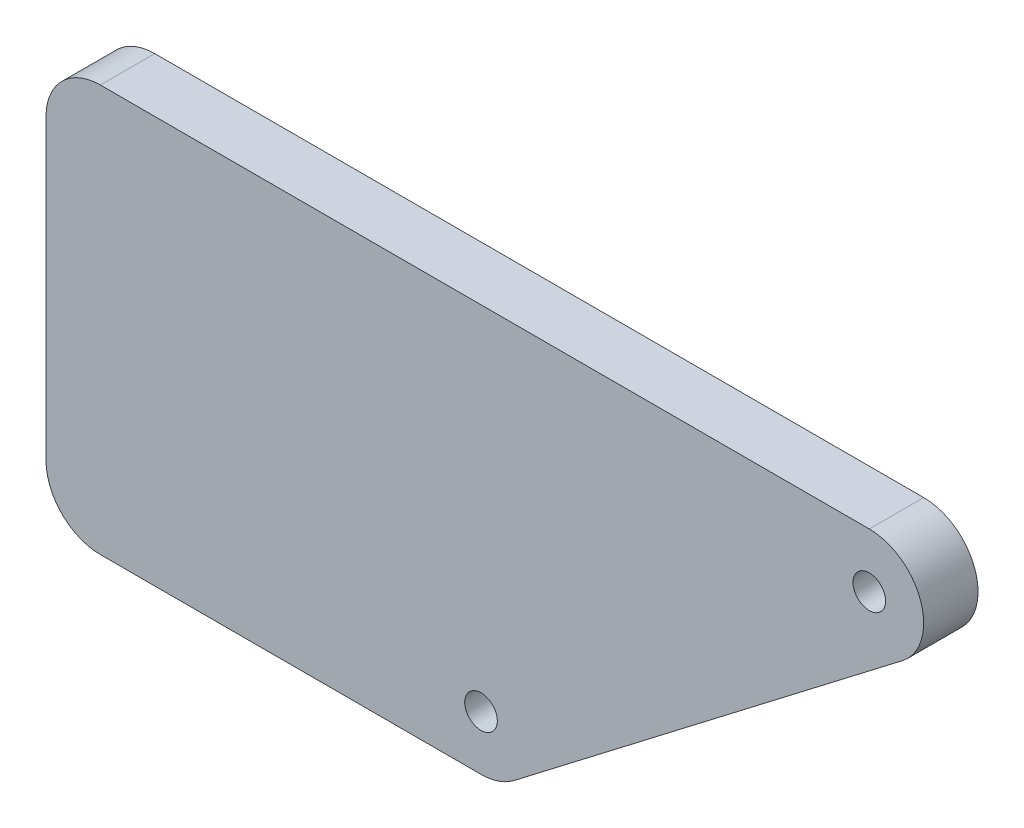
ISO-10303-21;
HEADER;
FILE_DESCRIPTION(('STEP AP214'),'2;1');
FILE_NAME('part.step','',(''),(''),'','','');
FILE_SCHEMA(('AUTOMOTIVE_DESIGN { 1 0 10303 214 1 1 1 1 }'));
ENDSEC;
DATA;
#1=APPLICATION_CONTEXT('core data for automotive mechanical design processes');
#2=APPLICATION_PROTOCOL_DEFINITION('international standard','automotive_design',2000,#1);
#3=PRODUCT_CONTEXT('',#1,'mechanical');
#4=PRODUCT('Part','Part','',(#3));
#5=PRODUCT_RELATED_PRODUCT_CATEGORY('part','',(#4));
#6=PRODUCT_DEFINITION_FORMATION('','',#4);
#7=PRODUCT_DEFINITION_CONTEXT('part definition',#1,'design');
#8=PRODUCT_DEFINITION('design','',#6,#7);
#9=PRODUCT_DEFINITION_SHAPE('','',#8);
#10=(LENGTH_UNIT() NAMED_UNIT(*) SI_UNIT(.MILLI.,.METRE.));
#11=(NAMED_UNIT(*) PLANE_ANGLE_UNIT() SI_UNIT($,.RADIAN.));
#12=(NAMED_UNIT(*) SI_UNIT($,.STERADIAN.) SOLID_ANGLE_UNIT());
#13=UNCERTAINTY_MEASURE_WITH_UNIT(LENGTH_MEASURE(1.E-05),#10,'distance_accuracy_value','');
#14=(GEOMETRIC_REPRESENTATION_CONTEXT(3) GLOBAL_UNCERTAINTY_ASSIGNED_CONTEXT((#13)) GLOBAL_UNIT_ASSIGNED_CONTEXT((#10,
#11,#12)) REPRESENTATION_CONTEXT('',''));
#15=CARTESIAN_POINT('',(0.,0.,0.));
#16=DIRECTION('',(0.,0.,1.));
#17=DIRECTION('',(1.,0.,0.));
#18=AXIS2_PLACEMENT_3D('',#15,#16,#17);
#19=CARTESIAN_POINT('',(-80.,0.,10.));
#20=DIRECTION('',(1.,0.,0.));
#21=DIRECTION('',(0.,1.,0.));
#22=AXIS2_PLACEMENT_3D('',#19,#20,#21);
#23=PLANE('',#22);
#24=DIRECTION('',(0.,-1.,0.));
#25=VECTOR('',#24,1.);
#26=CARTESIAN_POINT('',(-80.,0.,0.));
#27=LINE('',#26,#25);
#28=CARTESIAN_POINT('',(-80.,54.7885286107849,0.));
#29=VERTEX_POINT('',#28);
#30=CARTESIAN_POINT('',(-80.,0.,0.));
#31=VERTEX_POINT('',#30);
#32=EDGE_CURVE('E138',#29,#31,#27,.T.);
#33=ORIENTED_EDGE('',*,*,#32,.T.);
#34=DIRECTION('',(0.,0.,-1.));
#35=VECTOR('',#34,1.);
#36=CARTESIAN_POINT('',(-80.,0.,10.));
#37=LINE('',#36,#35);
#38=CARTESIAN_POINT('',(-80.,0.,10.));
#39=VERTEX_POINT('',#38);
#40=EDGE_CURVE('E11',#39,#31,#37,.T.);
#41=ORIENTED_EDGE('',*,*,#40,.F.);
#42=DIRECTION('',(0.,-1.,0.));
#43=VECTOR('',#42,1.);
#44=CARTESIAN_POINT('',(-80.,0.,10.));
#45=LINE('',#44,#43);
#46=CARTESIAN_POINT('',(-80.,54.7885286107849,10.));
#47=VERTEX_POINT('',#46);
#48=EDGE_CURVE('E161',#47,#39,#45,.T.);
#49=ORIENTED_EDGE('',*,*,#48,.F.);
#50=DIRECTION('',(0.,0.,-1.));
#51=VECTOR('',#50,1.);
#52=CARTESIAN_POINT('',(-80.,54.7885286107849,10.));
#53=LINE('',#52,#51);
#54=EDGE_CURVE('E137',#47,#29,#53,.T.);
#55=ORIENTED_EDGE('',*,*,#54,.T.);
#56=EDGE_LOOP('',(#33,#41,#49,#55));
#57=FACE_BOUND('',#56,.T.);
#58=ADVANCED_FACE('F37',(#57),#23,.F.);
#59=CARTESIAN_POINT('',(-70.,0.,10.));
#60=DIRECTION('',(0.,0.,-1.));
#61=DIRECTION('',(-1.,0.,0.));
#62=AXIS2_PLACEMENT_3D('',#59,#60,#61);
#63=CYLINDRICAL_SURFACE('',#62,9.99999999999999);
#64=CARTESIAN_POINT('',(-70.,0.,0.));
#65=DIRECTION('',(0.,0.,1.));
#66=DIRECTION('',(1.,0.,0.));
#67=AXIS2_PLACEMENT_3D('',#64,#65,#66);
#68=CIRCLE('',#67,9.99999999999999);
#69=CARTESIAN_POINT('',(-70.,-9.99999999999998,0.));
#70=VERTEX_POINT('',#69);
#71=EDGE_CURVE('E141',#31,#70,#68,.T.);
#72=ORIENTED_EDGE('',*,*,#71,.T.);
#73=DIRECTION('',(0.,0.,-1.));
#74=VECTOR('',#73,1.);
#75=CARTESIAN_POINT('',(-70.,-9.99999999999998,10.));
#76=LINE('',#75,#74);
#77=CARTESIAN_POINT('',(-70.,-9.99999999999998,10.));
#78=VERTEX_POINT('',#77);
#79=EDGE_CURVE('E45',#78,#70,#76,.T.);
#80=ORIENTED_EDGE('',*,*,#79,.F.);
#81=CARTESIAN_POINT('',(-70.,0.,10.));
#82=DIRECTION('',(0.,0.,1.));
#83=DIRECTION('',(1.,0.,0.));
#84=AXIS2_PLACEMENT_3D('',#81,#82,#83);
#85=CIRCLE('',#84,9.99999999999999);
#86=EDGE_CURVE('E92',#39,#78,#85,.T.);
#87=ORIENTED_EDGE('',*,*,#86,.F.);
#88=ORIENTED_EDGE('',*,*,#40,.T.);
#89=EDGE_LOOP('',(#72,#80,#87,#88));
#90=FACE_BOUND('',#89,.T.);
#91=ADVANCED_FACE('F194',(#90),#63,.T.);
#92=CARTESIAN_POINT('',(0.,-10.,10.));
#93=DIRECTION('',(0.,1.,0.));
#94=DIRECTION('',(-1.,0.,0.));
#95=AXIS2_PLACEMENT_3D('',#92,#93,#94);
#96=PLANE('',#95);
#97=DIRECTION('',(1.,0.,0.));
#98=VECTOR('',#97,1.);
#99=CARTESIAN_POINT('',(0.,-10.,0.));
#100=LINE('',#99,#98);
#101=CARTESIAN_POINT('',(0.,-10.,0.));
#102=VERTEX_POINT('',#101);
#103=EDGE_CURVE('E143',#70,#102,#100,.T.);
#104=ORIENTED_EDGE('',*,*,#103,.T.);
#105=DIRECTION('',(0.,0.,-1.));
#106=VECTOR('',#105,1.);
#107=CARTESIAN_POINT('',(0.,-10.,10.));
#108=LINE('',#107,#106);
#109=CARTESIAN_POINT('',(0.,-10.,10.));
#110=VERTEX_POINT('',#109);
#111=EDGE_CURVE('E167',#110,#102,#108,.T.);
#112=ORIENTED_EDGE('',*,*,#111,.F.);
#113=DIRECTION('',(1.,0.,0.));
#114=VECTOR('',#113,1.);
#115=CARTESIAN_POINT('',(0.,-10.,10.));
#116=LINE('',#115,#114);
#117=EDGE_CURVE('E175',#78,#110,#116,.T.);
#118=ORIENTED_EDGE('',*,*,#117,.F.);
#119=ORIENTED_EDGE('',*,*,#79,.T.);
#120=EDGE_LOOP('',(#104,#112,#118,#119));
#121=FACE_BOUND('',#120,.T.);
#122=ADVANCED_FACE('F173',(#121),#96,.F.);
#123=CARTESIAN_POINT('',(0.,0.,10.));
#124=DIRECTION('',(0.,0.,-1.));
#125=DIRECTION('',(-1.,0.,0.));
#126=AXIS2_PLACEMENT_3D('',#123,#124,#125);
#127=CYLINDRICAL_SURFACE('',#126,10.);
#128=CARTESIAN_POINT('',(0.,0.,0.));
#129=DIRECTION('',(0.,0.,1.));
#130=DIRECTION('',(1.,0.,0.));
#131=AXIS2_PLACEMENT_3D('',#128,#129,#130);
#132=CIRCLE('',#131,10.);
#133=CARTESIAN_POINT('',(6.08761429008721,-7.93353340291234,0.));
#134=VERTEX_POINT('',#133);
#135=EDGE_CURVE('E145',#102,#134,#132,.T.);
#136=ORIENTED_EDGE('',*,*,#135,.T.);
#137=DIRECTION('',(0.,0.,-1.));
#138=VECTOR('',#137,1.);
#139=CARTESIAN_POINT('',(6.08761429008721,-7.93353340291234,10.));
#140=LINE('',#139,#138);
#141=CARTESIAN_POINT('',(6.08761429008721,-7.93353340291234,10.));
#142=VERTEX_POINT('',#141);
#143=EDGE_CURVE('E165',#142,#134,#140,.T.);
#144=ORIENTED_EDGE('',*,*,#143,.F.);
#145=CARTESIAN_POINT('',(0.,0.,10.));
#146=DIRECTION('',(0.,0.,1.));
#147=DIRECTION('',(1.,0.,0.));
#148=AXIS2_PLACEMENT_3D('',#145,#146,#147);
#149=CIRCLE('',#148,10.);
#150=EDGE_CURVE('E186',#110,#142,#149,.T.);
#151=ORIENTED_EDGE('',*,*,#150,.F.);
#152=ORIENTED_EDGE('',*,*,#111,.T.);
#153=EDGE_LOOP('',(#136,#144,#151,#152));
#154=FACE_BOUND('',#153,.T.);
#155=ADVANCED_FACE('F184',(#154),#127,.T.);
#156=CARTESIAN_POINT('',(6.0876142900872,-7.93353340291234,10.));
#157=DIRECTION('',(0.608761429008721,-0.793353340291235,0.));
#158=DIRECTION('',(0.793353340291235,0.608761429008721,0.));
#159=AXIS2_PLACEMENT_3D('',#156,#157,#158);
#160=PLANE('',#159);
#161=DIRECTION('',(-0.793353340291235,-0.608761429008721,0.));
#162=VECTOR('',#161,1.);
#163=CARTESIAN_POINT('',(6.0876142900872,-7.93353340291234,0.));
#164=LINE('',#163,#162);
#165=CARTESIAN_POINT('',(77.4894149162984,46.8549952078725,0.));
#166=VERTEX_POINT('',#165);
#167=EDGE_CURVE('E148',#166,#134,#164,.T.);
#168=ORIENTED_EDGE('',*,*,#167,.F.);
#169=DIRECTION('',(0.,0.,-1.));
#170=VECTOR('',#169,1.);
#171=CARTESIAN_POINT('',(77.4894149162984,46.8549952078725,10.));
#172=LINE('',#171,#170);
#173=CARTESIAN_POINT('',(77.4894149162984,46.8549952078725,10.));
#174=VERTEX_POINT('',#173);
#175=EDGE_CURVE('E124',#174,#166,#172,.T.);
#176=ORIENTED_EDGE('',*,*,#175,.F.);
#177=DIRECTION('',(-0.793353340291235,-0.608761429008721,0.));
#178=VECTOR('',#177,1.);
#179=CARTESIAN_POINT('',(6.0876142900872,-7.93353340291234,10.));
#180=LINE('',#179,#178);
#181=EDGE_CURVE('E113',#174,#142,#180,.T.);
#182=ORIENTED_EDGE('',*,*,#181,.T.);
#183=ORIENTED_EDGE('',*,*,#143,.T.);
#184=EDGE_LOOP('',(#168,#176,#182,#183));
#185=FACE_BOUND('',#184,.T.);
#186=ADVANCED_FACE('F204',(#185),#160,.T.);
#187=CARTESIAN_POINT('',(71.4018006262112,54.7885286107849,10.));
#188=DIRECTION('',(0.,0.,-1.));
#189=DIRECTION('',(-1.,0.,0.));
#190=AXIS2_PLACEMENT_3D('',#187,#188,#189);
#191=CYLINDRICAL_SURFACE('',#190,9.99999999999999);
#192=CARTESIAN_POINT('',(71.4018006262112,54.7885286107849,0.));
#193=DIRECTION('',(0.,0.,1.));
#194=DIRECTION('',(1.,0.,0.));
#195=AXIS2_PLACEMENT_3D('',#192,#193,#194);
#196=CIRCLE('',#195,9.99999999999999);
#197=CARTESIAN_POINT('',(71.4018006262112,64.7885286107849,0.));
#198=VERTEX_POINT('',#197);
#199=EDGE_CURVE('E120',#166,#198,#196,.T.);
#200=ORIENTED_EDGE('',*,*,#199,.T.);
#201=DIRECTION('',(0.,0.,-1.));
#202=VECTOR('',#201,1.);
#203=CARTESIAN_POINT('',(71.4018006262112,64.7885286107849,10.));
#204=LINE('',#203,#202);
#205=CARTESIAN_POINT('',(71.4018006262112,64.7885286107849,10.));
#206=VERTEX_POINT('',#205);
#207=EDGE_CURVE('E117',#206,#198,#204,.T.);
#208=ORIENTED_EDGE('',*,*,#207,.F.);
#209=CARTESIAN_POINT('',(71.4018006262112,54.7885286107849,10.));
#210=DIRECTION('',(0.,0.,1.));
#211=DIRECTION('',(1.,0.,0.));
#212=AXIS2_PLACEMENT_3D('',#209,#210,#211);
#213=CIRCLE('',#212,9.99999999999999);
#214=EDGE_CURVE('E106',#174,#206,#213,.T.);
#215=ORIENTED_EDGE('',*,*,#214,.F.);
#216=ORIENTED_EDGE('',*,*,#175,.T.);
#217=EDGE_LOOP('',(#200,#208,#215,#216));
#218=FACE_BOUND('',#217,.T.);
#219=ADVANCED_FACE('F118',(#218),#191,.T.);
#220=CARTESIAN_POINT('',(0.,64.7885286107849,10.));
#221=DIRECTION('',(0.,1.,0.));
#222=DIRECTION('',(0.,0.,1.));
#223=AXIS2_PLACEMENT_3D('',#220,#221,#222);
#224=PLANE('',#223);
#225=DIRECTION('',(1.,0.,0.));
#226=VECTOR('',#225,1.);
#227=CARTESIAN_POINT('',(0.,64.7885286107849,0.));
#228=LINE('',#227,#226);
#229=CARTESIAN_POINT('',(-70.,64.7885286107848,0.));
#230=VERTEX_POINT('',#229);
#231=EDGE_CURVE('E152',#230,#198,#228,.T.);
#232=ORIENTED_EDGE('',*,*,#231,.F.);
#233=DIRECTION('',(0.,0.,-1.));
#234=VECTOR('',#233,1.);
#235=CARTESIAN_POINT('',(-70.,64.7885286107848,10.));
#236=LINE('',#235,#234);
#237=CARTESIAN_POINT('',(-70.,64.7885286107848,10.));
#238=VERTEX_POINT('',#237);
#239=EDGE_CURVE('E81',#238,#230,#236,.T.);
#240=ORIENTED_EDGE('',*,*,#239,.F.);
#241=DIRECTION('',(1.,0.,0.));
#242=VECTOR('',#241,1.);
#243=CARTESIAN_POINT('',(0.,64.7885286107849,10.));
#244=LINE('',#243,#242);
#245=EDGE_CURVE('E111',#238,#206,#244,.T.);
#246=ORIENTED_EDGE('',*,*,#245,.T.);
#247=ORIENTED_EDGE('',*,*,#207,.T.);
#248=EDGE_LOOP('',(#232,#240,#246,#247));
#249=FACE_BOUND('',#248,.T.);
#250=ADVANCED_FACE('F126',(#249),#224,.T.);
#251=CARTESIAN_POINT('',(71.4018006262112,54.7885286107849,10.));
#252=DIRECTION('',(0.,0.,-1.));
#253=DIRECTION('',(-1.,0.,0.));
#254=AXIS2_PLACEMENT_3D('',#251,#252,#253);
#255=CYLINDRICAL_SURFACE('',#254,3.00000000000001);
#256=CARTESIAN_POINT('',(71.4018006262112,54.7885286107849,10.));
#257=DIRECTION('',(0.,0.,1.));
#258=DIRECTION('',(1.,0.,0.));
#259=AXIS2_PLACEMENT_3D('',#256,#257,#258);
#260=CIRCLE('',#259,3.00000000000001);
#261=CARTESIAN_POINT('',(74.4018006262112,54.7885286107849,10.));
#262=VERTEX_POINT('',#261);
#263=EDGE_CURVE('E128',#262,#262,#260,.T.);
#264=ORIENTED_EDGE('',*,*,#263,.T.);
#265=EDGE_LOOP('',(#264));
#266=FACE_BOUND('',#265,.T.);
#267=CARTESIAN_POINT('',(71.4018006262112,54.7885286107849,0.));
#268=DIRECTION('',(0.,0.,1.));
#269=DIRECTION('',(1.,0.,0.));
#270=AXIS2_PLACEMENT_3D('',#267,#268,#269);
#271=CIRCLE('',#270,3.00000000000001);
#272=CARTESIAN_POINT('',(74.4018006262112,54.7885286107849,0.));
#273=VERTEX_POINT('',#272);
#274=EDGE_CURVE('E155',#273,#273,#271,.T.);
#275=ORIENTED_EDGE('',*,*,#274,.F.);
#276=EDGE_LOOP('',(#275));
#277=FACE_BOUND('',#276,.T.);
#278=ADVANCED_FACE('F212',(#266,#277),#255,.F.);
#279=CARTESIAN_POINT('',(-70.,54.7885286107848,10.));
#280=DIRECTION('',(0.,0.,-1.));
#281=DIRECTION('',(-1.,0.,0.));
#282=AXIS2_PLACEMENT_3D('',#279,#280,#281);
#283=CYLINDRICAL_SURFACE('',#282,9.99999999999999);
#284=CARTESIAN_POINT('',(-70.,54.7885286107848,0.));
#285=DIRECTION('',(0.,0.,1.));
#286=DIRECTION('',(1.,0.,0.));
#287=AXIS2_PLACEMENT_3D('',#284,#285,#286);
#288=CIRCLE('',#287,9.99999999999999);
#289=EDGE_CURVE('E84',#230,#29,#288,.T.);
#290=ORIENTED_EDGE('',*,*,#289,.T.);
#291=ORIENTED_EDGE('',*,*,#54,.F.);
#292=CARTESIAN_POINT('',(-70.,54.7885286107848,10.));
#293=DIRECTION('',(0.,0.,1.));
#294=DIRECTION('',(1.,0.,0.));
#295=AXIS2_PLACEMENT_3D('',#292,#293,#294);
#296=CIRCLE('',#295,9.99999999999999);
#297=EDGE_CURVE('E53',#238,#47,#296,.T.);
#298=ORIENTED_EDGE('',*,*,#297,.F.);
#299=ORIENTED_EDGE('',*,*,#239,.T.);
#300=EDGE_LOOP('',(#290,#291,#298,#299));
#301=FACE_BOUND('',#300,.T.);
#302=ADVANCED_FACE('F213',(#301),#283,.T.);
#303=CARTESIAN_POINT('',(0.,0.,10.));
#304=DIRECTION('',(0.,0.,-1.));
#305=DIRECTION('',(-1.,0.,0.));
#306=AXIS2_PLACEMENT_3D('',#303,#304,#305);
#307=CYLINDRICAL_SURFACE('',#306,3.);
#308=CARTESIAN_POINT('',(0.,0.,10.));
#309=DIRECTION('',(0.,0.,1.));
#310=DIRECTION('',(1.,0.,0.));
#311=AXIS2_PLACEMENT_3D('',#308,#309,#310);
#312=CIRCLE('',#311,3.);
#313=CARTESIAN_POINT('',(3.,0.,10.));
#314=VERTEX_POINT('',#313);
#315=EDGE_CURVE('E134',#314,#314,#312,.T.);
#316=ORIENTED_EDGE('',*,*,#315,.T.);
#317=EDGE_LOOP('',(#316));
#318=FACE_BOUND('',#317,.T.);
#319=CARTESIAN_POINT('',(0.,0.,0.));
#320=DIRECTION('',(0.,0.,1.));
#321=DIRECTION('',(1.,0.,0.));
#322=AXIS2_PLACEMENT_3D('',#319,#320,#321);
#323=CIRCLE('',#322,3.);
#324=CARTESIAN_POINT('',(3.,0.,0.));
#325=VERTEX_POINT('',#324);
#326=EDGE_CURVE('E158',#325,#325,#323,.T.);
#327=ORIENTED_EDGE('',*,*,#326,.F.);
#328=EDGE_LOOP('',(#327));
#329=FACE_BOUND('',#328,.T.);
#330=ADVANCED_FACE('F216',(#318,#329),#307,.F.);
#331=CARTESIAN_POINT('',(0.,0.,10.));
#332=DIRECTION('',(0.,0.,1.));
#333=DIRECTION('',(1.,0.,0.));
#334=AXIS2_PLACEMENT_3D('',#331,#332,#333);
#335=PLANE('',#334);
#336=ORIENTED_EDGE('',*,*,#48,.T.);
#337=ORIENTED_EDGE('',*,*,#86,.T.);
#338=ORIENTED_EDGE('',*,*,#117,.T.);
#339=ORIENTED_EDGE('',*,*,#150,.T.);
#340=ORIENTED_EDGE('',*,*,#181,.F.);
#341=ORIENTED_EDGE('',*,*,#214,.T.);
#342=ORIENTED_EDGE('',*,*,#245,.F.);
#343=ORIENTED_EDGE('',*,*,#297,.T.);
#344=EDGE_LOOP('',(#336,#337,#338,#339,#340,#341,#342,#343));
#345=FACE_BOUND('',#344,.T.);
#346=ORIENTED_EDGE('',*,*,#263,.F.);
#347=EDGE_LOOP('',(#346));
#348=FACE_BOUND('',#347,.T.);
#349=ORIENTED_EDGE('',*,*,#315,.F.);
#350=EDGE_LOOP('',(#349));
#351=FACE_BOUND('',#350,.T.);
#352=ADVANCED_FACE('F108',(#345,#348,#351),#335,.T.);
#353=CARTESIAN_POINT('',(0.,0.,0.));
#354=DIRECTION('',(0.,0.,1.));
#355=DIRECTION('',(1.,0.,0.));
#356=AXIS2_PLACEMENT_3D('',#353,#354,#355);
#357=PLANE('',#356);
#358=ORIENTED_EDGE('',*,*,#32,.F.);
#359=ORIENTED_EDGE('',*,*,#289,.F.);
#360=ORIENTED_EDGE('',*,*,#231,.T.);
#361=ORIENTED_EDGE('',*,*,#199,.F.);
#362=ORIENTED_EDGE('',*,*,#167,.T.);
#363=ORIENTED_EDGE('',*,*,#135,.F.);
#364=ORIENTED_EDGE('',*,*,#103,.F.);
#365=ORIENTED_EDGE('',*,*,#71,.F.);
#366=EDGE_LOOP('',(#358,#359,#360,#361,#362,#363,#364,#365));
#367=FACE_BOUND('',#366,.T.);
#368=ORIENTED_EDGE('',*,*,#274,.T.);
#369=EDGE_LOOP('',(#368));
#370=FACE_BOUND('',#369,.T.);
#371=ORIENTED_EDGE('',*,*,#326,.T.);
#372=EDGE_LOOP('',(#371));
#373=FACE_BOUND('',#372,.T.);
#374=ADVANCED_FACE('F179',(#367,#370,#373),#357,.F.);
#375=CLOSED_SHELL('',(#58,#91,#122,#155,#186,#219,#250,#278,#302,#330,#352,#374));
#376=MANIFOLD_SOLID_BREP('B2',#375);
#377=ADVANCED_BREP_SHAPE_REPRESENTATION('',(#18,#376),#14);
#378=SHAPE_DEFINITION_REPRESENTATION(#9,#377);
ENDSEC;
END-ISO-10303-21;
